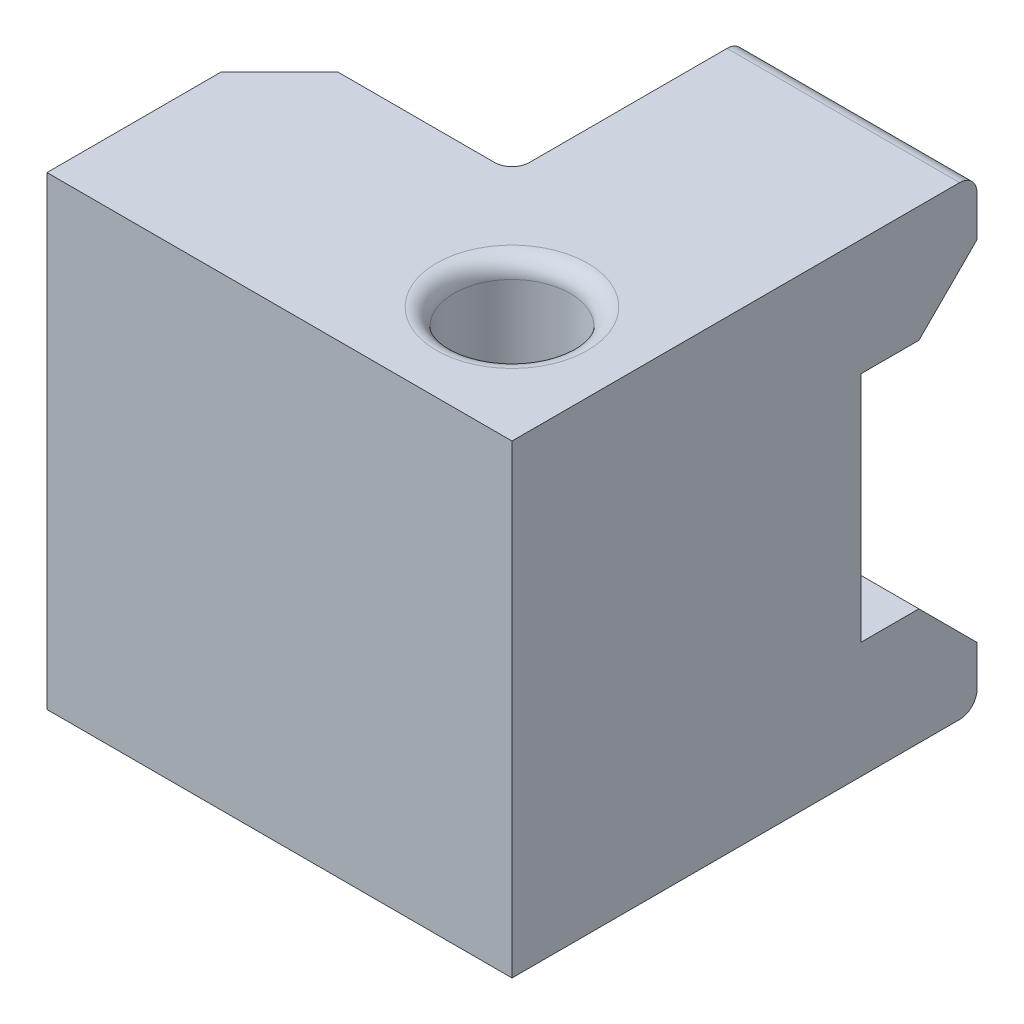
ISO-10303-21;
HEADER;
FILE_DESCRIPTION(('STEP AP214'),'2;1');
FILE_NAME('part.step','',(''),(''),'','','');
FILE_SCHEMA(('AUTOMOTIVE_DESIGN { 1 0 10303 214 1 1 1 1 }'));
ENDSEC;
DATA;
#1=APPLICATION_CONTEXT('core data for automotive mechanical design processes');
#2=APPLICATION_PROTOCOL_DEFINITION('international standard','automotive_design',2000,#1);
#3=PRODUCT_CONTEXT('',#1,'mechanical');
#4=PRODUCT('Part','Part','',(#3));
#5=PRODUCT_RELATED_PRODUCT_CATEGORY('part','',(#4));
#6=PRODUCT_DEFINITION_FORMATION('','',#4);
#7=PRODUCT_DEFINITION_CONTEXT('part definition',#1,'design');
#8=PRODUCT_DEFINITION('design','',#6,#7);
#9=PRODUCT_DEFINITION_SHAPE('','',#8);
#10=(LENGTH_UNIT() NAMED_UNIT(*) SI_UNIT(.MILLI.,.METRE.));
#11=(NAMED_UNIT(*) PLANE_ANGLE_UNIT() SI_UNIT($,.RADIAN.));
#12=(NAMED_UNIT(*) SI_UNIT($,.STERADIAN.) SOLID_ANGLE_UNIT());
#13=UNCERTAINTY_MEASURE_WITH_UNIT(LENGTH_MEASURE(1.E-05),#10,'distance_accuracy_value','');
#14=(GEOMETRIC_REPRESENTATION_CONTEXT(3) GLOBAL_UNCERTAINTY_ASSIGNED_CONTEXT((#13)) GLOBAL_UNIT_ASSIGNED_CONTEXT((#10,
#11,#12)) REPRESENTATION_CONTEXT('',''));
#15=CARTESIAN_POINT('',(0.,0.,0.));
#16=DIRECTION('',(0.,0.,1.));
#17=DIRECTION('',(1.,0.,0.));
#18=AXIS2_PLACEMENT_3D('',#15,#16,#17);
#19=CARTESIAN_POINT('',(-40.,80.,-80.));
#20=DIRECTION('',(0.,0.,1.));
#21=DIRECTION('',(1.,0.,0.));
#22=AXIS2_PLACEMENT_3D('',#19,#20,#21);
#23=PLANE('',#22);
#24=DIRECTION('',(0.,-1.,0.));
#25=VECTOR('',#24,1.);
#26=CARTESIAN_POINT('',(-40.,80.,-80.));
#27=LINE('',#26,#25);
#28=CARTESIAN_POINT('',(-40.,9.99999999999993,-80.));
#29=VERTEX_POINT('',#28);
#30=CARTESIAN_POINT('',(-40.,3.,-80.));
#31=VERTEX_POINT('',#30);
#32=EDGE_CURVE('E208',#29,#31,#27,.T.);
#33=ORIENTED_EDGE('',*,*,#32,.F.);
#34=DIRECTION('',(1.,0.,0.));
#35=VECTOR('',#34,1.);
#36=CARTESIAN_POINT('',(-40.,9.99999999999993,-80.));
#37=LINE('',#36,#35);
#38=CARTESIAN_POINT('',(0.,9.99999999999993,-80.));
#39=VERTEX_POINT('',#38);
#40=EDGE_CURVE('E248',#29,#39,#37,.T.);
#41=ORIENTED_EDGE('',*,*,#40,.T.);
#42=DIRECTION('',(0.,-1.,0.));
#43=VECTOR('',#42,1.);
#44=CARTESIAN_POINT('',(0.,80.,-80.));
#45=LINE('',#44,#43);
#46=CARTESIAN_POINT('',(0.,3.,-80.));
#47=VERTEX_POINT('',#46);
#48=EDGE_CURVE('E212',#39,#47,#45,.T.);
#49=ORIENTED_EDGE('',*,*,#48,.T.);
#50=DIRECTION('',(-1.,0.,0.));
#51=VECTOR('',#50,1.);
#52=CARTESIAN_POINT('',(-40.,3.,-80.));
#53=LINE('',#52,#51);
#54=EDGE_CURVE('E222',#47,#31,#53,.T.);
#55=ORIENTED_EDGE('',*,*,#54,.T.);
#56=EDGE_LOOP('',(#33,#41,#49,#55));
#57=FACE_BOUND('',#56,.T.);
#58=ADVANCED_FACE('F35',(#57),#23,.F.);
#59=CARTESIAN_POINT('',(0.,80.,0.));
#60=DIRECTION('',(0.,-1.,0.));
#61=DIRECTION('',(0.,0.,-1.));
#62=AXIS2_PLACEMENT_3D('',#59,#60,#61);
#63=PLANE('',#62);
#64=CARTESIAN_POINT('',(-20.,80.,-20.));
#65=DIRECTION('',(0.,-1.,0.));
#66=DIRECTION('',(0.,0.,-1.));
#67=AXIS2_PLACEMENT_3D('',#64,#65,#66);
#68=CIRCLE('',#67,13.);
#69=CARTESIAN_POINT('',(-20.,80.,-33.));
#70=VERTEX_POINT('',#69);
#71=EDGE_CURVE('E12',#70,#70,#68,.T.);
#72=ORIENTED_EDGE('',*,*,#71,.T.);
#73=EDGE_LOOP('',(#72));
#74=FACE_BOUND('',#73,.T.);
#75=DIRECTION('',(0.,0.,1.));
#76=VECTOR('',#75,1.);
#77=CARTESIAN_POINT('',(-40.,80.,-40.));
#78=LINE('',#77,#76);
#79=CARTESIAN_POINT('',(-40.,80.,-77.));
#80=VERTEX_POINT('',#79);
#81=CARTESIAN_POINT('',(-40.,80.,-43.));
#82=VERTEX_POINT('',#81);
#83=EDGE_CURVE('E184',#80,#82,#78,.T.);
#84=ORIENTED_EDGE('',*,*,#83,.T.);
#85=CARTESIAN_POINT('',(-43.,80.,-43.));
#86=DIRECTION('',(0.,-1.,0.));
#87=DIRECTION('',(0.,0.,-1.));
#88=AXIS2_PLACEMENT_3D('',#85,#86,#87);
#89=CIRCLE('',#88,3.);
#90=CARTESIAN_POINT('',(-43.,80.,-40.));
#91=VERTEX_POINT('',#90);
#92=EDGE_CURVE('E273',#82,#91,#89,.T.);
#93=ORIENTED_EDGE('',*,*,#92,.T.);
#94=DIRECTION('',(-1.,0.,0.));
#95=VECTOR('',#94,1.);
#96=CARTESIAN_POINT('',(-80.,80.,-40.));
#97=LINE('',#96,#95);
#98=CARTESIAN_POINT('',(-70.,80.,-40.));
#99=VERTEX_POINT('',#98);
#100=EDGE_CURVE('E187',#91,#99,#97,.T.);
#101=ORIENTED_EDGE('',*,*,#100,.T.);
#102=DIRECTION('',(0.707106781186546,0.,-0.707106781186549));
#103=VECTOR('',#102,1.);
#104=CARTESIAN_POINT('',(-80.,80.,-29.9999999999999));
#105=LINE('',#104,#103);
#106=CARTESIAN_POINT('',(-80.,80.,-29.9999999999999));
#107=VERTEX_POINT('',#106);
#108=EDGE_CURVE('E266',#99,#107,#105,.F.);
#109=ORIENTED_EDGE('',*,*,#108,.T.);
#110=DIRECTION('',(0.,0.,1.));
#111=VECTOR('',#110,1.);
#112=CARTESIAN_POINT('',(-80.,80.,0.));
#113=LINE('',#112,#111);
#114=CARTESIAN_POINT('',(-80.,80.,0.));
#115=VERTEX_POINT('',#114);
#116=EDGE_CURVE('E189',#107,#115,#113,.T.);
#117=ORIENTED_EDGE('',*,*,#116,.T.);
#118=DIRECTION('',(1.,0.,0.));
#119=VECTOR('',#118,1.);
#120=CARTESIAN_POINT('',(0.,80.,0.));
#121=LINE('',#120,#119);
#122=CARTESIAN_POINT('',(0.,80.,0.));
#123=VERTEX_POINT('',#122);
#124=EDGE_CURVE('E191',#115,#123,#121,.T.);
#125=ORIENTED_EDGE('',*,*,#124,.T.);
#126=DIRECTION('',(0.,0.,-1.));
#127=VECTOR('',#126,1.);
#128=CARTESIAN_POINT('',(0.,80.,-80.));
#129=LINE('',#128,#127);
#130=CARTESIAN_POINT('',(0.,80.,-77.));
#131=VERTEX_POINT('',#130);
#132=EDGE_CURVE('E181',#123,#131,#129,.T.);
#133=ORIENTED_EDGE('',*,*,#132,.T.);
#134=DIRECTION('',(-1.,0.,0.));
#135=VECTOR('',#134,1.);
#136=CARTESIAN_POINT('',(0.,80.,-77.));
#137=LINE('',#136,#135);
#138=EDGE_CURVE('E232',#131,#80,#137,.T.);
#139=ORIENTED_EDGE('',*,*,#138,.T.);
#140=EDGE_LOOP('',(#84,#93,#101,#109,#117,#125,#133,#139));
#141=FACE_BOUND('',#140,.T.);
#142=ADVANCED_FACE('F296',(#74,#141),#63,.F.);
#143=CARTESIAN_POINT('',(0.,0.,0.));
#144=DIRECTION('',(0.,-1.,0.));
#145=DIRECTION('',(0.,0.,-1.));
#146=AXIS2_PLACEMENT_3D('',#143,#144,#145);
#147=PLANE('',#146);
#148=CARTESIAN_POINT('',(-20.,0.,-20.));
#149=DIRECTION('',(0.,-1.,0.));
#150=DIRECTION('',(0.,0.,-1.));
#151=AXIS2_PLACEMENT_3D('',#148,#149,#150);
#152=CIRCLE('',#151,13.);
#153=CARTESIAN_POINT('',(-20.,0.,-33.));
#154=VERTEX_POINT('',#153);
#155=EDGE_CURVE('E275',#154,#154,#152,.F.);
#156=ORIENTED_EDGE('',*,*,#155,.T.);
#157=EDGE_LOOP('',(#156));
#158=FACE_BOUND('',#157,.T.);
#159=DIRECTION('',(0.,0.,1.));
#160=VECTOR('',#159,1.);
#161=CARTESIAN_POINT('',(-80.,0.,0.));
#162=LINE('',#161,#160);
#163=CARTESIAN_POINT('',(-80.,0.,-29.9999999999999));
#164=VERTEX_POINT('',#163);
#165=CARTESIAN_POINT('',(-80.,0.,0.));
#166=VERTEX_POINT('',#165);
#167=EDGE_CURVE('E200',#164,#166,#162,.T.);
#168=ORIENTED_EDGE('',*,*,#167,.F.);
#169=DIRECTION('',(-0.707106781186546,0.,0.707106781186549));
#170=VECTOR('',#169,1.);
#171=CARTESIAN_POINT('',(-55.0000000000001,0.,-54.9999999999999));
#172=LINE('',#171,#170);
#173=CARTESIAN_POINT('',(-70.,0.,-40.));
#174=VERTEX_POINT('',#173);
#175=EDGE_CURVE('E260',#164,#174,#172,.F.);
#176=ORIENTED_EDGE('',*,*,#175,.T.);
#177=DIRECTION('',(-1.,0.,0.));
#178=VECTOR('',#177,1.);
#179=CARTESIAN_POINT('',(-80.,0.,-40.));
#180=LINE('',#179,#178);
#181=CARTESIAN_POINT('',(-43.,0.,-40.));
#182=VERTEX_POINT('',#181);
#183=EDGE_CURVE('E198',#182,#174,#180,.T.);
#184=ORIENTED_EDGE('',*,*,#183,.F.);
#185=CARTESIAN_POINT('',(-43.,0.,-43.));
#186=DIRECTION('',(0.,-1.,0.));
#187=DIRECTION('',(0.,0.,-1.));
#188=AXIS2_PLACEMENT_3D('',#185,#186,#187);
#189=CIRCLE('',#188,3.);
#190=CARTESIAN_POINT('',(-40.,0.,-43.));
#191=VERTEX_POINT('',#190);
#192=EDGE_CURVE('E58',#182,#191,#189,.F.);
#193=ORIENTED_EDGE('',*,*,#192,.T.);
#194=DIRECTION('',(0.,0.,1.));
#195=VECTOR('',#194,1.);
#196=CARTESIAN_POINT('',(-40.,0.,-40.));
#197=LINE('',#196,#195);
#198=CARTESIAN_POINT('',(-40.,0.,-77.));
#199=VERTEX_POINT('',#198);
#200=EDGE_CURVE('E196',#199,#191,#197,.T.);
#201=ORIENTED_EDGE('',*,*,#200,.F.);
#202=DIRECTION('',(-1.,0.,0.));
#203=VECTOR('',#202,1.);
#204=CARTESIAN_POINT('',(0.,0.,-77.));
#205=LINE('',#204,#203);
#206=CARTESIAN_POINT('',(0.,0.,-77.));
#207=VERTEX_POINT('',#206);
#208=EDGE_CURVE('E227',#199,#207,#205,.F.);
#209=ORIENTED_EDGE('',*,*,#208,.T.);
#210=DIRECTION('',(0.,0.,-1.));
#211=VECTOR('',#210,1.);
#212=CARTESIAN_POINT('',(0.,0.,-80.));
#213=LINE('',#212,#211);
#214=CARTESIAN_POINT('',(0.,0.,0.));
#215=VERTEX_POINT('',#214);
#216=EDGE_CURVE('E179',#215,#207,#213,.T.);
#217=ORIENTED_EDGE('',*,*,#216,.F.);
#218=DIRECTION('',(1.,0.,0.));
#219=VECTOR('',#218,1.);
#220=CARTESIAN_POINT('',(0.,0.,0.));
#221=LINE('',#220,#219);
#222=EDGE_CURVE('E185',#166,#215,#221,.T.);
#223=ORIENTED_EDGE('',*,*,#222,.F.);
#224=EDGE_LOOP('',(#168,#176,#184,#193,#201,#209,#217,#223));
#225=FACE_BOUND('',#224,.T.);
#226=ADVANCED_FACE('F303',(#158,#225),#147,.T.);
#227=CARTESIAN_POINT('',(0.,80.,-80.));
#228=DIRECTION('',(-1.,0.,0.));
#229=DIRECTION('',(0.,0.,1.));
#230=AXIS2_PLACEMENT_3D('',#227,#228,#229);
#231=PLANE('',#230);
#232=ORIENTED_EDGE('',*,*,#48,.F.);
#233=DIRECTION('',(0.,-0.707106781186549,-0.707106781186546));
#234=VECTOR('',#233,1.);
#235=CARTESIAN_POINT('',(0.,9.99999999999993,-80.));
#236=LINE('',#235,#234);
#237=CARTESIAN_POINT('',(0.,20.,-70.));
#238=VERTEX_POINT('',#237);
#239=EDGE_CURVE('E251',#39,#238,#236,.F.);
#240=ORIENTED_EDGE('',*,*,#239,.T.);
#241=DIRECTION('',(0.,0.,-1.));
#242=VECTOR('',#241,1.);
#243=CARTESIAN_POINT('',(0.,20.,-60.));
#244=LINE('',#243,#242);
#245=CARTESIAN_POINT('',(0.,20.,-60.));
#246=VERTEX_POINT('',#245);
#247=EDGE_CURVE('E171',#246,#238,#244,.T.);
#248=ORIENTED_EDGE('',*,*,#247,.F.);
#249=DIRECTION('',(0.,-1.,0.));
#250=VECTOR('',#249,1.);
#251=CARTESIAN_POINT('',(0.,60.,-60.));
#252=LINE('',#251,#250);
#253=CARTESIAN_POINT('',(0.,60.,-60.));
#254=VERTEX_POINT('',#253);
#255=EDGE_CURVE('E161',#254,#246,#252,.T.);
#256=ORIENTED_EDGE('',*,*,#255,.F.);
#257=DIRECTION('',(0.,0.,1.));
#258=VECTOR('',#257,1.);
#259=CARTESIAN_POINT('',(0.,60.,-80.));
#260=LINE('',#259,#258);
#261=CARTESIAN_POINT('',(0.,60.,-70.));
#262=VERTEX_POINT('',#261);
#263=EDGE_CURVE('E151',#262,#254,#260,.T.);
#264=ORIENTED_EDGE('',*,*,#263,.F.);
#265=DIRECTION('',(0.,-0.707106781186549,0.707106781186546));
#266=VECTOR('',#265,1.);
#267=CARTESIAN_POINT('',(0.,60.,-70.));
#268=LINE('',#267,#266);
#269=CARTESIAN_POINT('',(0.,70.0000000000001,-80.));
#270=VERTEX_POINT('',#269);
#271=EDGE_CURVE('E242',#262,#270,#268,.F.);
#272=ORIENTED_EDGE('',*,*,#271,.T.);
#273=CARTESIAN_POINT('',(0.,77.,-80.));
#274=VERTEX_POINT('',#273);
#275=EDGE_CURVE('E213',#274,#270,#45,.T.);
#276=ORIENTED_EDGE('',*,*,#275,.F.);
#277=CARTESIAN_POINT('',(0.,77.,-77.));
#278=DIRECTION('',(-1.,0.,0.));
#279=DIRECTION('',(0.,0.,1.));
#280=AXIS2_PLACEMENT_3D('',#277,#278,#279);
#281=CIRCLE('',#280,3.);
#282=EDGE_CURVE('E239',#274,#131,#281,.F.);
#283=ORIENTED_EDGE('',*,*,#282,.T.);
#284=ORIENTED_EDGE('',*,*,#132,.F.);
#285=DIRECTION('',(0.,-1.,0.));
#286=VECTOR('',#285,1.);
#287=CARTESIAN_POINT('',(0.,80.,0.));
#288=LINE('',#287,#286);
#289=EDGE_CURVE('E193',#123,#215,#288,.T.);
#290=ORIENTED_EDGE('',*,*,#289,.T.);
#291=ORIENTED_EDGE('',*,*,#216,.T.);
#292=CARTESIAN_POINT('',(0.,3.,-77.));
#293=DIRECTION('',(-1.,0.,0.));
#294=DIRECTION('',(0.,0.,1.));
#295=AXIS2_PLACEMENT_3D('',#292,#293,#294);
#296=CIRCLE('',#295,3.);
#297=EDGE_CURVE('E229',#207,#47,#296,.F.);
#298=ORIENTED_EDGE('',*,*,#297,.T.);
#299=EDGE_LOOP('',(#232,#240,#248,#256,#264,#272,#276,#283,#284,#290,#291,#298));
#300=FACE_BOUND('',#299,.T.);
#301=ADVANCED_FACE('F174',(#300),#231,.F.);
#302=ORIENTED_EDGE('',*,*,#275,.T.);
#303=DIRECTION('',(-1.,0.,0.));
#304=VECTOR('',#303,1.);
#305=CARTESIAN_POINT('',(-40.,70.0000000000001,-80.));
#306=LINE('',#305,#304);
#307=CARTESIAN_POINT('',(-40.,70.0000000000001,-80.));
#308=VERTEX_POINT('',#307);
#309=EDGE_CURVE('E244',#270,#308,#306,.T.);
#310=ORIENTED_EDGE('',*,*,#309,.T.);
#311=CARTESIAN_POINT('',(-40.,77.,-80.));
#312=VERTEX_POINT('',#311);
#313=EDGE_CURVE('E209',#312,#308,#27,.T.);
#314=ORIENTED_EDGE('',*,*,#313,.F.);
#315=DIRECTION('',(-1.,0.,0.));
#316=VECTOR('',#315,1.);
#317=CARTESIAN_POINT('',(-40.,77.,-80.));
#318=LINE('',#317,#316);
#319=EDGE_CURVE('E237',#312,#274,#318,.F.);
#320=ORIENTED_EDGE('',*,*,#319,.T.);
#321=EDGE_LOOP('',(#302,#310,#314,#320));
#322=FACE_BOUND('',#321,.T.);
#323=ADVANCED_FACE('F299',(#322),#23,.F.);
#324=CARTESIAN_POINT('',(-40.,80.,-40.));
#325=DIRECTION('',(1.,0.,0.));
#326=DIRECTION('',(0.,0.,-1.));
#327=AXIS2_PLACEMENT_3D('',#324,#325,#326);
#328=PLANE('',#327);
#329=ORIENTED_EDGE('',*,*,#200,.T.);
#330=DIRECTION('',(0.,-1.,0.));
#331=VECTOR('',#330,1.);
#332=CARTESIAN_POINT('',(-40.,80.,-43.));
#333=LINE('',#332,#331);
#334=EDGE_CURVE('E50',#191,#82,#333,.F.);
#335=ORIENTED_EDGE('',*,*,#334,.T.);
#336=ORIENTED_EDGE('',*,*,#83,.F.);
#337=CARTESIAN_POINT('',(-40.,77.,-77.));
#338=DIRECTION('',(1.,0.,0.));
#339=DIRECTION('',(0.,0.,-1.));
#340=AXIS2_PLACEMENT_3D('',#337,#338,#339);
#341=CIRCLE('',#340,3.);
#342=EDGE_CURVE('E235',#80,#312,#341,.F.);
#343=ORIENTED_EDGE('',*,*,#342,.T.);
#344=ORIENTED_EDGE('',*,*,#313,.T.);
#345=DIRECTION('',(0.,0.707106781186549,-0.707106781186546));
#346=VECTOR('',#345,1.);
#347=CARTESIAN_POINT('',(-40.,60.,-70.));
#348=LINE('',#347,#346);
#349=CARTESIAN_POINT('',(-40.,60.,-70.));
#350=VERTEX_POINT('',#349);
#351=EDGE_CURVE('E246',#308,#350,#348,.F.);
#352=ORIENTED_EDGE('',*,*,#351,.T.);
#353=DIRECTION('',(0.,0.,1.));
#354=VECTOR('',#353,1.);
#355=CARTESIAN_POINT('',(-40.,60.,-40.));
#356=LINE('',#355,#354);
#357=CARTESIAN_POINT('',(-40.,60.,-60.));
#358=VERTEX_POINT('',#357);
#359=EDGE_CURVE('E216',#350,#358,#356,.T.);
#360=ORIENTED_EDGE('',*,*,#359,.T.);
#361=DIRECTION('',(0.,-1.,0.));
#362=VECTOR('',#361,1.);
#363=CARTESIAN_POINT('',(-40.,80.,-60.));
#364=LINE('',#363,#362);
#365=CARTESIAN_POINT('',(-40.,20.,-60.));
#366=VERTEX_POINT('',#365);
#367=EDGE_CURVE('E169',#358,#366,#364,.T.);
#368=ORIENTED_EDGE('',*,*,#367,.T.);
#369=DIRECTION('',(0.,0.,-1.));
#370=VECTOR('',#369,1.);
#371=CARTESIAN_POINT('',(-40.,20.,-40.));
#372=LINE('',#371,#370);
#373=CARTESIAN_POINT('',(-40.,20.,-70.));
#374=VERTEX_POINT('',#373);
#375=EDGE_CURVE('E219',#366,#374,#372,.T.);
#376=ORIENTED_EDGE('',*,*,#375,.T.);
#377=DIRECTION('',(0.,0.707106781186549,0.707106781186546));
#378=VECTOR('',#377,1.);
#379=CARTESIAN_POINT('',(-40.,9.99999999999993,-80.));
#380=LINE('',#379,#378);
#381=EDGE_CURVE('E255',#374,#29,#380,.F.);
#382=ORIENTED_EDGE('',*,*,#381,.T.);
#383=ORIENTED_EDGE('',*,*,#32,.T.);
#384=CARTESIAN_POINT('',(-40.,3.,-77.));
#385=DIRECTION('',(1.,0.,0.));
#386=DIRECTION('',(0.,0.,-1.));
#387=AXIS2_PLACEMENT_3D('',#384,#385,#386);
#388=CIRCLE('',#387,3.);
#389=EDGE_CURVE('E225',#31,#199,#388,.F.);
#390=ORIENTED_EDGE('',*,*,#389,.T.);
#391=EDGE_LOOP('',(#329,#335,#336,#343,#344,#352,#360,#368,#376,#382,#383,#390));
#392=FACE_BOUND('',#391,.T.);
#393=ADVANCED_FACE('F310',(#392),#328,.F.);
#394=CARTESIAN_POINT('',(-80.,80.,-40.));
#395=DIRECTION('',(0.,0.,1.));
#396=DIRECTION('',(1.,0.,0.));
#397=AXIS2_PLACEMENT_3D('',#394,#395,#396);
#398=PLANE('',#397);
#399=ORIENTED_EDGE('',*,*,#100,.F.);
#400=DIRECTION('',(0.,-1.,0.));
#401=VECTOR('',#400,1.);
#402=CARTESIAN_POINT('',(-43.,0.,-40.));
#403=LINE('',#402,#401);
#404=EDGE_CURVE('E268',#91,#182,#403,.T.);
#405=ORIENTED_EDGE('',*,*,#404,.T.);
#406=ORIENTED_EDGE('',*,*,#183,.T.);
#407=DIRECTION('',(0.,1.,0.));
#408=VECTOR('',#407,1.);
#409=CARTESIAN_POINT('',(-70.,80.,-40.));
#410=LINE('',#409,#408);
#411=EDGE_CURVE('E263',#174,#99,#410,.T.);
#412=ORIENTED_EDGE('',*,*,#411,.T.);
#413=EDGE_LOOP('',(#399,#405,#406,#412));
#414=FACE_BOUND('',#413,.T.);
#415=ADVANCED_FACE('F316',(#414),#398,.F.);
#416=CARTESIAN_POINT('',(-80.,80.,0.));
#417=DIRECTION('',(1.,0.,0.));
#418=DIRECTION('',(0.,0.,-1.));
#419=AXIS2_PLACEMENT_3D('',#416,#417,#418);
#420=PLANE('',#419);
#421=ORIENTED_EDGE('',*,*,#116,.F.);
#422=DIRECTION('',(0.,-1.,0.));
#423=VECTOR('',#422,1.);
#424=CARTESIAN_POINT('',(-80.,80.,-29.9999999999999));
#425=LINE('',#424,#423);
#426=EDGE_CURVE('E257',#107,#164,#425,.T.);
#427=ORIENTED_EDGE('',*,*,#426,.T.);
#428=ORIENTED_EDGE('',*,*,#167,.T.);
#429=DIRECTION('',(0.,-1.,0.));
#430=VECTOR('',#429,1.);
#431=CARTESIAN_POINT('',(-80.,80.,0.));
#432=LINE('',#431,#430);
#433=EDGE_CURVE('E205',#115,#166,#432,.T.);
#434=ORIENTED_EDGE('',*,*,#433,.F.);
#435=EDGE_LOOP('',(#421,#427,#428,#434));
#436=FACE_BOUND('',#435,.T.);
#437=ADVANCED_FACE('F363',(#436),#420,.F.);
#438=CARTESIAN_POINT('',(0.,80.,0.));
#439=DIRECTION('',(0.,0.,-1.));
#440=DIRECTION('',(-1.,0.,0.));
#441=AXIS2_PLACEMENT_3D('',#438,#439,#440);
#442=PLANE('',#441);
#443=ORIENTED_EDGE('',*,*,#222,.T.);
#444=ORIENTED_EDGE('',*,*,#289,.F.);
#445=ORIENTED_EDGE('',*,*,#124,.F.);
#446=ORIENTED_EDGE('',*,*,#433,.T.);
#447=EDGE_LOOP('',(#443,#444,#445,#446));
#448=FACE_BOUND('',#447,.T.);
#449=ADVANCED_FACE('F335',(#448),#442,.F.);
#450=CARTESIAN_POINT('',(-20.,80.,-20.));
#451=DIRECTION('',(0.,-1.,0.));
#452=DIRECTION('',(0.,0.,-1.));
#453=AXIS2_PLACEMENT_3D('',#450,#451,#452);
#454=CYLINDRICAL_SURFACE('',#453,10.);
#455=CARTESIAN_POINT('',(-20.,77.,-20.));
#456=DIRECTION('',(0.,-1.,0.));
#457=DIRECTION('',(0.,0.,-1.));
#458=AXIS2_PLACEMENT_3D('',#455,#456,#457);
#459=CIRCLE('',#458,10.);
#460=CARTESIAN_POINT('',(-20.,77.,-30.));
#461=VERTEX_POINT('',#460);
#462=EDGE_CURVE('E43',#461,#461,#459,.F.);
#463=ORIENTED_EDGE('',*,*,#462,.T.);
#464=EDGE_LOOP('',(#463));
#465=FACE_BOUND('',#464,.T.);
#466=CARTESIAN_POINT('',(-20.,3.,-20.));
#467=DIRECTION('',(0.,-1.,0.));
#468=DIRECTION('',(0.,0.,-1.));
#469=AXIS2_PLACEMENT_3D('',#466,#467,#468);
#470=CIRCLE('',#469,10.);
#471=CARTESIAN_POINT('',(-20.,3.,-30.));
#472=VERTEX_POINT('',#471);
#473=EDGE_CURVE('E278',#472,#472,#470,.T.);
#474=ORIENTED_EDGE('',*,*,#473,.T.);
#475=EDGE_LOOP('',(#474));
#476=FACE_BOUND('',#475,.T.);
#477=ADVANCED_FACE('F283',(#465,#476),#454,.F.);
#478=CARTESIAN_POINT('',(-80.,20.,-60.));
#479=DIRECTION('',(0.,-1.,0.));
#480=DIRECTION('',(0.,0.,-1.));
#481=AXIS2_PLACEMENT_3D('',#478,#479,#480);
#482=PLANE('',#481);
#483=ORIENTED_EDGE('',*,*,#247,.T.);
#484=DIRECTION('',(-1.,0.,0.));
#485=VECTOR('',#484,1.);
#486=CARTESIAN_POINT('',(-80.,20.,-70.));
#487=LINE('',#486,#485);
#488=EDGE_CURVE('E253',#238,#374,#487,.T.);
#489=ORIENTED_EDGE('',*,*,#488,.T.);
#490=ORIENTED_EDGE('',*,*,#375,.F.);
#491=DIRECTION('',(1.,0.,0.));
#492=VECTOR('',#491,1.);
#493=CARTESIAN_POINT('',(-80.,20.,-60.));
#494=LINE('',#493,#492);
#495=EDGE_CURVE('E170',#366,#246,#494,.T.);
#496=ORIENTED_EDGE('',*,*,#495,.T.);
#497=EDGE_LOOP('',(#483,#489,#490,#496));
#498=FACE_BOUND('',#497,.T.);
#499=ADVANCED_FACE('F351',(#498),#482,.F.);
#500=CARTESIAN_POINT('',(-80.,60.,-60.));
#501=DIRECTION('',(0.,0.,1.));
#502=DIRECTION('',(0.,-1.,0.));
#503=AXIS2_PLACEMENT_3D('',#500,#501,#502);
#504=PLANE('',#503);
#505=DIRECTION('',(1.,0.,0.));
#506=VECTOR('',#505,1.);
#507=CARTESIAN_POINT('',(-80.,60.,-60.));
#508=LINE('',#507,#506);
#509=EDGE_CURVE('E155',#358,#254,#508,.T.);
#510=ORIENTED_EDGE('',*,*,#509,.T.);
#511=ORIENTED_EDGE('',*,*,#255,.T.);
#512=ORIENTED_EDGE('',*,*,#495,.F.);
#513=ORIENTED_EDGE('',*,*,#367,.F.);
#514=EDGE_LOOP('',(#510,#511,#512,#513));
#515=FACE_BOUND('',#514,.T.);
#516=ADVANCED_FACE('F165',(#515),#504,.F.);
#517=CARTESIAN_POINT('',(-80.,60.,-80.));
#518=DIRECTION('',(0.,1.,0.));
#519=DIRECTION('',(0.,0.,1.));
#520=AXIS2_PLACEMENT_3D('',#517,#518,#519);
#521=PLANE('',#520);
#522=ORIENTED_EDGE('',*,*,#359,.F.);
#523=DIRECTION('',(1.,0.,0.));
#524=VECTOR('',#523,1.);
#525=CARTESIAN_POINT('',(-80.,60.,-70.));
#526=LINE('',#525,#524);
#527=EDGE_CURVE('E158',#350,#262,#526,.T.);
#528=ORIENTED_EDGE('',*,*,#527,.T.);
#529=ORIENTED_EDGE('',*,*,#263,.T.);
#530=ORIENTED_EDGE('',*,*,#509,.F.);
#531=EDGE_LOOP('',(#522,#528,#529,#530));
#532=FACE_BOUND('',#531,.T.);
#533=ADVANCED_FACE('F154',(#532),#521,.F.);
#534=CARTESIAN_POINT('',(-40.,3.,-77.));
#535=DIRECTION('',(1.,0.,0.));
#536=DIRECTION('',(0.,0.,-1.));
#537=AXIS2_PLACEMENT_3D('',#534,#535,#536);
#538=CYLINDRICAL_SURFACE('',#537,3.);
#539=ORIENTED_EDGE('',*,*,#297,.F.);
#540=ORIENTED_EDGE('',*,*,#208,.F.);
#541=ORIENTED_EDGE('',*,*,#389,.F.);
#542=ORIENTED_EDGE('',*,*,#54,.F.);
#543=EDGE_LOOP('',(#539,#540,#541,#542));
#544=FACE_BOUND('',#543,.T.);
#545=ADVANCED_FACE('F343',(#544),#538,.T.);
#546=CARTESIAN_POINT('',(0.,77.,-77.));
#547=DIRECTION('',(-1.,0.,0.));
#548=DIRECTION('',(0.,0.,1.));
#549=AXIS2_PLACEMENT_3D('',#546,#547,#548);
#550=CYLINDRICAL_SURFACE('',#549,3.);
#551=ORIENTED_EDGE('',*,*,#282,.F.);
#552=ORIENTED_EDGE('',*,*,#319,.F.);
#553=ORIENTED_EDGE('',*,*,#342,.F.);
#554=ORIENTED_EDGE('',*,*,#138,.F.);
#555=EDGE_LOOP('',(#551,#552,#553,#554));
#556=FACE_BOUND('',#555,.T.);
#557=ADVANCED_FACE('F326',(#556),#550,.T.);
#558=CARTESIAN_POINT('',(-80.,60.,-70.));
#559=DIRECTION('',(0.,0.707106781186546,0.707106781186549));
#560=DIRECTION('',(1.,0.,0.));
#561=AXIS2_PLACEMENT_3D('',#558,#559,#560);
#562=PLANE('',#561);
#563=ORIENTED_EDGE('',*,*,#351,.F.);
#564=ORIENTED_EDGE('',*,*,#309,.F.);
#565=ORIENTED_EDGE('',*,*,#271,.F.);
#566=ORIENTED_EDGE('',*,*,#527,.F.);
#567=EDGE_LOOP('',(#563,#564,#565,#566));
#568=FACE_BOUND('',#567,.T.);
#569=ADVANCED_FACE('F324',(#568),#562,.F.);
#570=CARTESIAN_POINT('',(-40.,9.99999999999993,-80.));
#571=DIRECTION('',(0.,-0.707106781186546,0.707106781186549));
#572=DIRECTION('',(1.,0.,0.));
#573=AXIS2_PLACEMENT_3D('',#570,#571,#572);
#574=PLANE('',#573);
#575=ORIENTED_EDGE('',*,*,#381,.F.);
#576=ORIENTED_EDGE('',*,*,#488,.F.);
#577=ORIENTED_EDGE('',*,*,#239,.F.);
#578=ORIENTED_EDGE('',*,*,#40,.F.);
#579=EDGE_LOOP('',(#575,#576,#577,#578));
#580=FACE_BOUND('',#579,.T.);
#581=ADVANCED_FACE('F348',(#580),#574,.F.);
#582=CARTESIAN_POINT('',(-80.,80.,-29.9999999999999));
#583=DIRECTION('',(0.707106781186549,0.,0.707106781186546));
#584=DIRECTION('',(0.,-1.,0.));
#585=AXIS2_PLACEMENT_3D('',#582,#583,#584);
#586=PLANE('',#585);
#587=ORIENTED_EDGE('',*,*,#108,.F.);
#588=ORIENTED_EDGE('',*,*,#411,.F.);
#589=ORIENTED_EDGE('',*,*,#175,.F.);
#590=ORIENTED_EDGE('',*,*,#426,.F.);
#591=EDGE_LOOP('',(#587,#588,#589,#590));
#592=FACE_BOUND('',#591,.T.);
#593=ADVANCED_FACE('F361',(#592),#586,.F.);
#594=CARTESIAN_POINT('',(-43.,80.,-43.));
#595=DIRECTION('',(0.,1.,0.));
#596=DIRECTION('',(0.,0.,1.));
#597=AXIS2_PLACEMENT_3D('',#594,#595,#596);
#598=CYLINDRICAL_SURFACE('',#597,3.);
#599=ORIENTED_EDGE('',*,*,#92,.F.);
#600=ORIENTED_EDGE('',*,*,#334,.F.);
#601=ORIENTED_EDGE('',*,*,#192,.F.);
#602=ORIENTED_EDGE('',*,*,#404,.F.);
#603=EDGE_LOOP('',(#599,#600,#601,#602));
#604=FACE_BOUND('',#603,.T.);
#605=ADVANCED_FACE('F292',(#604),#598,.F.);
#606=CARTESIAN_POINT('',(-20.,3.,-20.));
#607=DIRECTION('',(0.,-1.,0.));
#608=DIRECTION('',(0.,0.,-1.));
#609=AXIS2_PLACEMENT_3D('',#606,#607,#608);
#610=TOROIDAL_SURFACE('',#609,13.,3.);
#611=ORIENTED_EDGE('',*,*,#473,.F.);
#612=EDGE_LOOP('',(#611));
#613=FACE_BOUND('',#612,.T.);
#614=ORIENTED_EDGE('',*,*,#155,.F.);
#615=EDGE_LOOP('',(#614));
#616=FACE_BOUND('',#615,.T.);
#617=ADVANCED_FACE('F287',(#613,#616),#610,.T.);
#618=CARTESIAN_POINT('',(-20.,77.,-20.));
#619=DIRECTION('',(0.,-1.,0.));
#620=DIRECTION('',(0.,0.,-1.));
#621=AXIS2_PLACEMENT_3D('',#618,#619,#620);
#622=TOROIDAL_SURFACE('',#621,13.,3.);
#623=ORIENTED_EDGE('',*,*,#71,.F.);
#624=EDGE_LOOP('',(#623));
#625=FACE_BOUND('',#624,.T.);
#626=ORIENTED_EDGE('',*,*,#462,.F.);
#627=EDGE_LOOP('',(#626));
#628=FACE_BOUND('',#627,.T.);
#629=ADVANCED_FACE('F37',(#625,#628),#622,.T.);
#630=CLOSED_SHELL('',(#58,#142,#226,#301,#323,#393,#415,#437,#449,#477,#499,#516,#533,#545,#557,
#569,#581,#593,#605,#617,#629));
#631=MANIFOLD_SOLID_BREP('B2',#630);
#632=ADVANCED_BREP_SHAPE_REPRESENTATION('',(#18,#631),#14);
#633=SHAPE_DEFINITION_REPRESENTATION(#9,#632);
ENDSEC;
END-ISO-10303-21;
